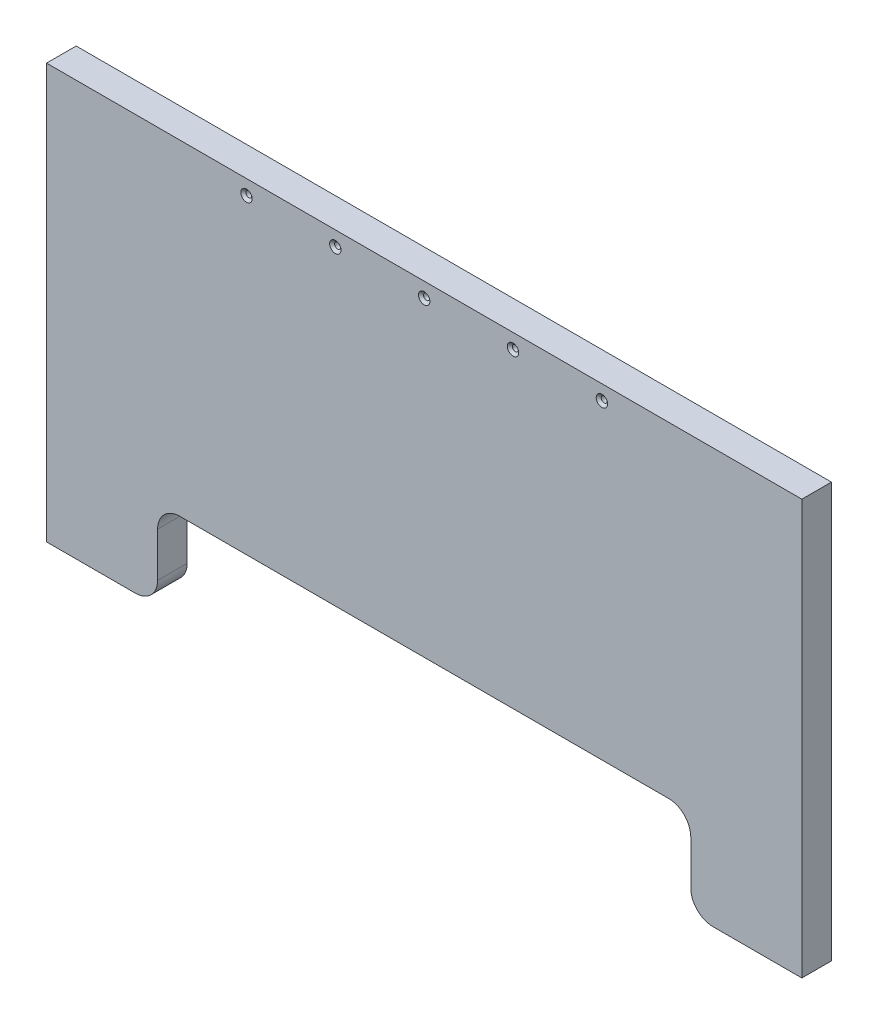
ISO-10303-21;
HEADER;
FILE_DESCRIPTION(('STEP AP214'),'2;1');
FILE_NAME('part.step','',(''),(''),'','','');
FILE_SCHEMA(('AUTOMOTIVE_DESIGN { 1 0 10303 214 1 1 1 1 }'));
ENDSEC;
DATA;
#1=APPLICATION_CONTEXT('core data for automotive mechanical design processes');
#2=APPLICATION_PROTOCOL_DEFINITION('international standard','automotive_design',2000,#1);
#3=PRODUCT_CONTEXT('',#1,'mechanical');
#4=PRODUCT('Part','Part','',(#3));
#5=PRODUCT_RELATED_PRODUCT_CATEGORY('part','',(#4));
#6=PRODUCT_DEFINITION_FORMATION('','',#4);
#7=PRODUCT_DEFINITION_CONTEXT('part definition',#1,'design');
#8=PRODUCT_DEFINITION('design','',#6,#7);
#9=PRODUCT_DEFINITION_SHAPE('','',#8);
#10=(LENGTH_UNIT() NAMED_UNIT(*) SI_UNIT(.MILLI.,.METRE.));
#11=(NAMED_UNIT(*) PLANE_ANGLE_UNIT() SI_UNIT($,.RADIAN.));
#12=(NAMED_UNIT(*) SI_UNIT($,.STERADIAN.) SOLID_ANGLE_UNIT());
#13=UNCERTAINTY_MEASURE_WITH_UNIT(LENGTH_MEASURE(1.E-05),#10,'distance_accuracy_value','');
#14=(GEOMETRIC_REPRESENTATION_CONTEXT(3) GLOBAL_UNCERTAINTY_ASSIGNED_CONTEXT((#13)) GLOBAL_UNIT_ASSIGNED_CONTEXT((#10,
#11,#12)) REPRESENTATION_CONTEXT('',''));
#15=CARTESIAN_POINT('',(0.,0.,0.));
#16=DIRECTION('',(0.,0.,1.));
#17=DIRECTION('',(1.,0.,0.));
#18=AXIS2_PLACEMENT_3D('',#15,#16,#17);
#19=CARTESIAN_POINT('',(323.85,279.4,25.4));
#20=DIRECTION('',(-1.,0.,0.));
#21=DIRECTION('',(0.,-1.,0.));
#22=AXIS2_PLACEMENT_3D('',#19,#20,#21);
#23=PLANE('',#22);
#24=DIRECTION('',(0.,1.,0.));
#25=VECTOR('',#24,1.);
#26=CARTESIAN_POINT('',(323.85,279.4,0.));
#27=LINE('',#26,#25);
#28=CARTESIAN_POINT('',(323.85,-76.2,0.));
#29=VERTEX_POINT('',#28);
#30=CARTESIAN_POINT('',(323.85,279.4,0.));
#31=VERTEX_POINT('',#30);
#32=EDGE_CURVE('E145',#29,#31,#27,.T.);
#33=ORIENTED_EDGE('',*,*,#32,.T.);
#34=DIRECTION('',(0.,0.,-1.));
#35=VECTOR('',#34,1.);
#36=CARTESIAN_POINT('',(323.85,279.4,25.4));
#37=LINE('',#36,#35);
#38=CARTESIAN_POINT('',(323.85,279.4,25.4));
#39=VERTEX_POINT('',#38);
#40=EDGE_CURVE('E126',#39,#31,#37,.T.);
#41=ORIENTED_EDGE('',*,*,#40,.F.);
#42=DIRECTION('',(0.,1.,0.));
#43=VECTOR('',#42,1.);
#44=CARTESIAN_POINT('',(323.85,279.4,25.4));
#45=LINE('',#44,#43);
#46=CARTESIAN_POINT('',(323.85,-76.2,25.4));
#47=VERTEX_POINT('',#46);
#48=EDGE_CURVE('E132',#47,#39,#45,.T.);
#49=ORIENTED_EDGE('',*,*,#48,.F.);
#50=DIRECTION('',(0.,0.,-1.));
#51=VECTOR('',#50,1.);
#52=CARTESIAN_POINT('',(323.85,-76.2,25.4));
#53=LINE('',#52,#51);
#54=EDGE_CURVE('E211',#47,#29,#53,.T.);
#55=ORIENTED_EDGE('',*,*,#54,.T.);
#56=EDGE_LOOP('',(#33,#41,#49,#55));
#57=FACE_BOUND('',#56,.T.);
#58=ADVANCED_FACE('F32',(#57),#23,.F.);
#59=CARTESIAN_POINT('',(-323.85,279.4,25.4));
#60=DIRECTION('',(0.,-1.,0.));
#61=DIRECTION('',(0.,0.,-1.));
#62=AXIS2_PLACEMENT_3D('',#59,#60,#61);
#63=PLANE('',#62);
#64=DIRECTION('',(-1.,0.,0.));
#65=VECTOR('',#64,1.);
#66=CARTESIAN_POINT('',(-323.85,279.4,0.));
#67=LINE('',#66,#65);
#68=CARTESIAN_POINT('',(-323.85,279.4,0.));
#69=VERTEX_POINT('',#68);
#70=EDGE_CURVE('E213',#31,#69,#67,.T.);
#71=ORIENTED_EDGE('',*,*,#70,.T.);
#72=DIRECTION('',(0.,0.,-1.));
#73=VECTOR('',#72,1.);
#74=CARTESIAN_POINT('',(-323.85,279.4,25.4));
#75=LINE('',#74,#73);
#76=CARTESIAN_POINT('',(-323.85,279.4,25.4));
#77=VERTEX_POINT('',#76);
#78=EDGE_CURVE('E129',#77,#69,#75,.T.);
#79=ORIENTED_EDGE('',*,*,#78,.F.);
#80=DIRECTION('',(-1.,0.,0.));
#81=VECTOR('',#80,1.);
#82=CARTESIAN_POINT('',(-323.85,279.4,25.4));
#83=LINE('',#82,#81);
#84=EDGE_CURVE('E122',#39,#77,#83,.T.);
#85=ORIENTED_EDGE('',*,*,#84,.F.);
#86=ORIENTED_EDGE('',*,*,#40,.T.);
#87=EDGE_LOOP('',(#71,#79,#85,#86));
#88=FACE_BOUND('',#87,.T.);
#89=ADVANCED_FACE('F124',(#88),#63,.F.);
#90=CARTESIAN_POINT('',(-323.85,279.4,25.4));
#91=DIRECTION('',(1.,0.,0.));
#92=DIRECTION('',(0.,1.,0.));
#93=AXIS2_PLACEMENT_3D('',#90,#91,#92);
#94=PLANE('',#93);
#95=DIRECTION('',(0.,-1.,0.));
#96=VECTOR('',#95,1.);
#97=CARTESIAN_POINT('',(-323.85,279.4,0.));
#98=LINE('',#97,#96);
#99=CARTESIAN_POINT('',(-323.85,-76.2,0.));
#100=VERTEX_POINT('',#99);
#101=EDGE_CURVE('E216',#69,#100,#98,.T.);
#102=ORIENTED_EDGE('',*,*,#101,.T.);
#103=DIRECTION('',(0.,0.,-1.));
#104=VECTOR('',#103,1.);
#105=CARTESIAN_POINT('',(-323.85,-76.2,25.4));
#106=LINE('',#105,#104);
#107=CARTESIAN_POINT('',(-323.85,-76.2,25.4));
#108=VERTEX_POINT('',#107);
#109=EDGE_CURVE('E150',#108,#100,#106,.T.);
#110=ORIENTED_EDGE('',*,*,#109,.F.);
#111=DIRECTION('',(0.,-1.,0.));
#112=VECTOR('',#111,1.);
#113=CARTESIAN_POINT('',(-323.85,279.4,25.4));
#114=LINE('',#113,#112);
#115=EDGE_CURVE('E131',#77,#108,#114,.T.);
#116=ORIENTED_EDGE('',*,*,#115,.F.);
#117=ORIENTED_EDGE('',*,*,#78,.T.);
#118=EDGE_LOOP('',(#102,#110,#116,#117));
#119=FACE_BOUND('',#118,.T.);
#120=ADVANCED_FACE('F318',(#119),#94,.F.);
#121=CARTESIAN_POINT('',(-323.85,-76.2,25.4));
#122=DIRECTION('',(0.,1.,0.));
#123=DIRECTION('',(-1.,0.,0.));
#124=AXIS2_PLACEMENT_3D('',#121,#122,#123);
#125=PLANE('',#124);
#126=DIRECTION('',(1.,0.,0.));
#127=VECTOR('',#126,1.);
#128=CARTESIAN_POINT('',(-323.85,-76.2,0.));
#129=LINE('',#128,#127);
#130=CARTESIAN_POINT('',(-247.65,-76.2,0.));
#131=VERTEX_POINT('',#130);
#132=EDGE_CURVE('E192',#100,#131,#129,.T.);
#133=ORIENTED_EDGE('',*,*,#132,.T.);
#134=DIRECTION('',(0.,0.,-1.));
#135=VECTOR('',#134,1.);
#136=CARTESIAN_POINT('',(-247.65,-76.2,25.4));
#137=LINE('',#136,#135);
#138=CARTESIAN_POINT('',(-247.65,-76.2,25.4));
#139=VERTEX_POINT('',#138);
#140=EDGE_CURVE('E175',#131,#139,#137,.F.);
#141=ORIENTED_EDGE('',*,*,#140,.T.);
#142=DIRECTION('',(1.,0.,0.));
#143=VECTOR('',#142,1.);
#144=CARTESIAN_POINT('',(-323.85,-76.2,25.4));
#145=LINE('',#144,#143);
#146=EDGE_CURVE('E206',#108,#139,#145,.T.);
#147=ORIENTED_EDGE('',*,*,#146,.F.);
#148=ORIENTED_EDGE('',*,*,#109,.T.);
#149=EDGE_LOOP('',(#133,#141,#147,#148));
#150=FACE_BOUND('',#149,.T.);
#151=ADVANCED_FACE('F230',(#150),#125,.F.);
#152=CARTESIAN_POINT('',(-228.6,-76.2,25.4));
#153=DIRECTION('',(-1.,0.,0.));
#154=DIRECTION('',(0.,0.,1.));
#155=AXIS2_PLACEMENT_3D('',#152,#153,#154);
#156=PLANE('',#155);
#157=DIRECTION('',(0.,1.,0.));
#158=VECTOR('',#157,1.);
#159=CARTESIAN_POINT('',(-228.6,-76.2,25.4));
#160=LINE('',#159,#158);
#161=CARTESIAN_POINT('',(-228.6,-57.15,25.4));
#162=VERTEX_POINT('',#161);
#163=CARTESIAN_POINT('',(-228.6,-19.05,25.4));
#164=VERTEX_POINT('',#163);
#165=EDGE_CURVE('E199',#162,#164,#160,.T.);
#166=ORIENTED_EDGE('',*,*,#165,.F.);
#167=DIRECTION('',(0.,0.,-1.));
#168=VECTOR('',#167,1.);
#169=CARTESIAN_POINT('',(-228.6,-57.15,25.4));
#170=LINE('',#169,#168);
#171=CARTESIAN_POINT('',(-228.6,-57.15,0.));
#172=VERTEX_POINT('',#171);
#173=EDGE_CURVE('E172',#162,#172,#170,.T.);
#174=ORIENTED_EDGE('',*,*,#173,.T.);
#175=DIRECTION('',(0.,1.,0.));
#176=VECTOR('',#175,1.);
#177=CARTESIAN_POINT('',(-228.6,-76.2,0.));
#178=LINE('',#177,#176);
#179=CARTESIAN_POINT('',(-228.6,-19.05,0.));
#180=VERTEX_POINT('',#179);
#181=EDGE_CURVE('E185',#172,#180,#178,.T.);
#182=ORIENTED_EDGE('',*,*,#181,.T.);
#183=DIRECTION('',(0.,0.,-1.));
#184=VECTOR('',#183,1.);
#185=CARTESIAN_POINT('',(-228.6,-19.05,25.4));
#186=LINE('',#185,#184);
#187=EDGE_CURVE('E47',#180,#164,#186,.F.);
#188=ORIENTED_EDGE('',*,*,#187,.T.);
#189=EDGE_LOOP('',(#166,#174,#182,#188));
#190=FACE_BOUND('',#189,.T.);
#191=ADVANCED_FACE('F190',(#190),#156,.F.);
#192=CARTESIAN_POINT('',(228.6,0.,25.4));
#193=DIRECTION('',(0.,1.,0.));
#194=DIRECTION('',(0.,0.,1.));
#195=AXIS2_PLACEMENT_3D('',#192,#193,#194);
#196=PLANE('',#195);
#197=DIRECTION('',(1.,0.,0.));
#198=VECTOR('',#197,1.);
#199=CARTESIAN_POINT('',(228.6,0.,0.));
#200=LINE('',#199,#198);
#201=CARTESIAN_POINT('',(-209.55,0.,0.));
#202=VERTEX_POINT('',#201);
#203=CARTESIAN_POINT('',(209.55,0.,0.));
#204=VERTEX_POINT('',#203);
#205=EDGE_CURVE('E187',#202,#204,#200,.T.);
#206=ORIENTED_EDGE('',*,*,#205,.T.);
#207=DIRECTION('',(0.,0.,-1.));
#208=VECTOR('',#207,1.);
#209=CARTESIAN_POINT('',(209.55,0.,25.4));
#210=LINE('',#209,#208);
#211=CARTESIAN_POINT('',(209.55,0.,25.4));
#212=VERTEX_POINT('',#211);
#213=EDGE_CURVE('E159',#204,#212,#210,.F.);
#214=ORIENTED_EDGE('',*,*,#213,.T.);
#215=DIRECTION('',(1.,0.,0.));
#216=VECTOR('',#215,1.);
#217=CARTESIAN_POINT('',(228.6,0.,25.4));
#218=LINE('',#217,#216);
#219=CARTESIAN_POINT('',(-209.55,0.,25.4));
#220=VERTEX_POINT('',#219);
#221=EDGE_CURVE('E197',#220,#212,#218,.T.);
#222=ORIENTED_EDGE('',*,*,#221,.F.);
#223=DIRECTION('',(0.,0.,-1.));
#224=VECTOR('',#223,1.);
#225=CARTESIAN_POINT('',(-209.55,0.,0.));
#226=LINE('',#225,#224);
#227=EDGE_CURVE('E156',#220,#202,#226,.T.);
#228=ORIENTED_EDGE('',*,*,#227,.T.);
#229=EDGE_LOOP('',(#206,#214,#222,#228));
#230=FACE_BOUND('',#229,.T.);
#231=ADVANCED_FACE('F201',(#230),#196,.F.);
#232=CARTESIAN_POINT('',(228.6,-76.2,25.4));
#233=DIRECTION('',(1.,0.,0.));
#234=DIRECTION('',(0.,0.,-1.));
#235=AXIS2_PLACEMENT_3D('',#232,#233,#234);
#236=PLANE('',#235);
#237=DIRECTION('',(0.,-1.,0.));
#238=VECTOR('',#237,1.);
#239=CARTESIAN_POINT('',(228.6,-76.2,25.4));
#240=LINE('',#239,#238);
#241=CARTESIAN_POINT('',(228.6,-19.05,25.4));
#242=VERTEX_POINT('',#241);
#243=CARTESIAN_POINT('',(228.6,-57.15,25.4));
#244=VERTEX_POINT('',#243);
#245=EDGE_CURVE('E203',#242,#244,#240,.T.);
#246=ORIENTED_EDGE('',*,*,#245,.F.);
#247=DIRECTION('',(0.,0.,-1.));
#248=VECTOR('',#247,1.);
#249=CARTESIAN_POINT('',(228.6,-19.05,0.));
#250=LINE('',#249,#248);
#251=CARTESIAN_POINT('',(228.6,-19.05,0.));
#252=VERTEX_POINT('',#251);
#253=EDGE_CURVE('E148',#242,#252,#250,.T.);
#254=ORIENTED_EDGE('',*,*,#253,.T.);
#255=DIRECTION('',(0.,-1.,0.));
#256=VECTOR('',#255,1.);
#257=CARTESIAN_POINT('',(228.6,-76.2,0.));
#258=LINE('',#257,#256);
#259=CARTESIAN_POINT('',(228.6,-57.15,0.));
#260=VERTEX_POINT('',#259);
#261=EDGE_CURVE('E221',#252,#260,#258,.T.);
#262=ORIENTED_EDGE('',*,*,#261,.T.);
#263=DIRECTION('',(0.,0.,-1.));
#264=VECTOR('',#263,1.);
#265=CARTESIAN_POINT('',(228.6,-57.15,25.4));
#266=LINE('',#265,#264);
#267=EDGE_CURVE('E146',#260,#244,#266,.F.);
#268=ORIENTED_EDGE('',*,*,#267,.T.);
#269=EDGE_LOOP('',(#246,#254,#262,#268));
#270=FACE_BOUND('',#269,.T.);
#271=ADVANCED_FACE('F453',(#270),#236,.F.);
#272=CARTESIAN_POINT('',(323.85,-76.2,25.4));
#273=DIRECTION('',(0.,1.,0.));
#274=DIRECTION('',(-1.,0.,0.));
#275=AXIS2_PLACEMENT_3D('',#272,#273,#274);
#276=PLANE('',#275);
#277=DIRECTION('',(1.,0.,0.));
#278=VECTOR('',#277,1.);
#279=CARTESIAN_POINT('',(323.85,-76.2,25.4));
#280=LINE('',#279,#278);
#281=CARTESIAN_POINT('',(247.65,-76.2,25.4));
#282=VERTEX_POINT('',#281);
#283=EDGE_CURVE('E138',#282,#47,#280,.T.);
#284=ORIENTED_EDGE('',*,*,#283,.F.);
#285=DIRECTION('',(0.,0.,-1.));
#286=VECTOR('',#285,1.);
#287=CARTESIAN_POINT('',(247.65,-76.2,25.4));
#288=LINE('',#287,#286);
#289=CARTESIAN_POINT('',(247.65,-76.2,0.));
#290=VERTEX_POINT('',#289);
#291=EDGE_CURVE('E161',#282,#290,#288,.T.);
#292=ORIENTED_EDGE('',*,*,#291,.T.);
#293=DIRECTION('',(1.,0.,0.));
#294=VECTOR('',#293,1.);
#295=CARTESIAN_POINT('',(323.85,-76.2,0.));
#296=LINE('',#295,#294);
#297=EDGE_CURVE('E142',#290,#29,#296,.T.);
#298=ORIENTED_EDGE('',*,*,#297,.T.);
#299=ORIENTED_EDGE('',*,*,#54,.F.);
#300=EDGE_LOOP('',(#284,#292,#298,#299));
#301=FACE_BOUND('',#300,.T.);
#302=ADVANCED_FACE('F287',(#301),#276,.F.);
#303=CARTESIAN_POINT('',(0.,0.,25.4));
#304=DIRECTION('',(0.,0.,-1.));
#305=DIRECTION('',(-1.,0.,0.));
#306=AXIS2_PLACEMENT_3D('',#303,#304,#305);
#307=PLANE('',#306);
#308=CARTESIAN_POINT('',(0.,266.7,25.4));
#309=DIRECTION('',(0.,0.,1.));
#310=DIRECTION('',(1.,0.,0.));
#311=AXIS2_PLACEMENT_3D('',#308,#309,#310);
#312=CIRCLE('',#311,4.8895);
#313=CARTESIAN_POINT('',(4.8895,266.7,25.4));
#314=VERTEX_POINT('',#313);
#315=EDGE_CURVE('E279',#314,#314,#312,.T.);
#316=ORIENTED_EDGE('',*,*,#315,.F.);
#317=EDGE_LOOP('',(#316));
#318=FACE_BOUND('',#317,.T.);
#319=CARTESIAN_POINT('',(76.2,266.7,25.4));
#320=DIRECTION('',(0.,0.,1.));
#321=DIRECTION('',(1.,0.,0.));
#322=AXIS2_PLACEMENT_3D('',#319,#320,#321);
#323=CIRCLE('',#322,4.88950000000001);
#324=CARTESIAN_POINT('',(81.0895,266.7,25.4));
#325=VERTEX_POINT('',#324);
#326=EDGE_CURVE('E270',#325,#325,#323,.T.);
#327=ORIENTED_EDGE('',*,*,#326,.F.);
#328=EDGE_LOOP('',(#327));
#329=FACE_BOUND('',#328,.T.);
#330=CARTESIAN_POINT('',(152.4,266.7,25.4));
#331=DIRECTION('',(0.,0.,1.));
#332=DIRECTION('',(1.,0.,0.));
#333=AXIS2_PLACEMENT_3D('',#330,#331,#332);
#334=CIRCLE('',#333,4.88949999999999);
#335=CARTESIAN_POINT('',(157.2895,266.7,25.4));
#336=VERTEX_POINT('',#335);
#337=EDGE_CURVE('E261',#336,#336,#334,.T.);
#338=ORIENTED_EDGE('',*,*,#337,.F.);
#339=EDGE_LOOP('',(#338));
#340=FACE_BOUND('',#339,.T.);
#341=CARTESIAN_POINT('',(-76.2,266.699999999999,25.4));
#342=DIRECTION('',(0.,0.,1.));
#343=DIRECTION('',(1.,0.,0.));
#344=AXIS2_PLACEMENT_3D('',#341,#342,#343);
#345=CIRCLE('',#344,4.88950000000001);
#346=CARTESIAN_POINT('',(-71.3105,266.699999999999,25.4));
#347=VERTEX_POINT('',#346);
#348=EDGE_CURVE('E252',#347,#347,#345,.T.);
#349=ORIENTED_EDGE('',*,*,#348,.F.);
#350=EDGE_LOOP('',(#349));
#351=FACE_BOUND('',#350,.T.);
#352=CARTESIAN_POINT('',(-152.4,266.699999999999,25.4));
#353=DIRECTION('',(0.,0.,1.));
#354=DIRECTION('',(1.,0.,0.));
#355=AXIS2_PLACEMENT_3D('',#352,#353,#354);
#356=CIRCLE('',#355,4.88949999999999);
#357=CARTESIAN_POINT('',(-147.5105,266.699999999999,25.4));
#358=VERTEX_POINT('',#357);
#359=EDGE_CURVE('E243',#358,#358,#356,.T.);
#360=ORIENTED_EDGE('',*,*,#359,.F.);
#361=EDGE_LOOP('',(#360));
#362=FACE_BOUND('',#361,.T.);
#363=ORIENTED_EDGE('',*,*,#245,.T.);
#364=CARTESIAN_POINT('',(247.65,-57.15,25.4));
#365=DIRECTION('',(0.,0.,-1.));
#366=DIRECTION('',(-1.,0.,0.));
#367=AXIS2_PLACEMENT_3D('',#364,#365,#366);
#368=CIRCLE('',#367,19.05);
#369=EDGE_CURVE('E169',#244,#282,#368,.F.);
#370=ORIENTED_EDGE('',*,*,#369,.T.);
#371=ORIENTED_EDGE('',*,*,#283,.T.);
#372=ORIENTED_EDGE('',*,*,#48,.T.);
#373=ORIENTED_EDGE('',*,*,#84,.T.);
#374=ORIENTED_EDGE('',*,*,#115,.T.);
#375=ORIENTED_EDGE('',*,*,#146,.T.);
#376=CARTESIAN_POINT('',(-247.65,-57.15,25.4));
#377=DIRECTION('',(0.,0.,-1.));
#378=DIRECTION('',(-1.,0.,0.));
#379=AXIS2_PLACEMENT_3D('',#376,#377,#378);
#380=CIRCLE('',#379,19.05);
#381=EDGE_CURVE('E54',#139,#162,#380,.F.);
#382=ORIENTED_EDGE('',*,*,#381,.T.);
#383=ORIENTED_EDGE('',*,*,#165,.T.);
#384=CARTESIAN_POINT('',(-209.55,-19.05,25.4));
#385=DIRECTION('',(0.,0.,-1.));
#386=DIRECTION('',(-1.,0.,0.));
#387=AXIS2_PLACEMENT_3D('',#384,#385,#386);
#388=CIRCLE('',#387,19.05);
#389=EDGE_CURVE('E11',#164,#220,#388,.T.);
#390=ORIENTED_EDGE('',*,*,#389,.T.);
#391=ORIENTED_EDGE('',*,*,#221,.T.);
#392=CARTESIAN_POINT('',(209.55,-19.05,25.4));
#393=DIRECTION('',(0.,0.,-1.));
#394=DIRECTION('',(-1.,0.,0.));
#395=AXIS2_PLACEMENT_3D('',#392,#393,#394);
#396=CIRCLE('',#395,19.05);
#397=EDGE_CURVE('E179',#212,#242,#396,.T.);
#398=ORIENTED_EDGE('',*,*,#397,.T.);
#399=EDGE_LOOP('',(#363,#370,#371,#372,#373,#374,#375,#382,#383,#390,#391,#398));
#400=FACE_BOUND('',#399,.T.);
#401=ADVANCED_FACE('F136',(#318,#329,#340,#351,#362,#400),#307,.F.);
#402=CARTESIAN_POINT('',(0.,0.,0.));
#403=DIRECTION('',(0.,0.,-1.));
#404=DIRECTION('',(-1.,0.,0.));
#405=AXIS2_PLACEMENT_3D('',#402,#403,#404);
#406=PLANE('',#405);
#407=CARTESIAN_POINT('',(0.,266.7,0.));
#408=DIRECTION('',(0.,0.,1.));
#409=DIRECTION('',(1.,0.,0.));
#410=AXIS2_PLACEMENT_3D('',#407,#408,#409);
#411=CIRCLE('',#410,2.5527);
#412=CARTESIAN_POINT('',(2.5527,266.7,0.));
#413=VERTEX_POINT('',#412);
#414=EDGE_CURVE('E273',#413,#413,#411,.T.);
#415=ORIENTED_EDGE('',*,*,#414,.T.);
#416=EDGE_LOOP('',(#415));
#417=FACE_BOUND('',#416,.T.);
#418=CARTESIAN_POINT('',(76.2,266.7,0.));
#419=DIRECTION('',(0.,0.,1.));
#420=DIRECTION('',(1.,0.,0.));
#421=AXIS2_PLACEMENT_3D('',#418,#419,#420);
#422=CIRCLE('',#421,2.55270000000001);
#423=CARTESIAN_POINT('',(78.7527,266.7,0.));
#424=VERTEX_POINT('',#423);
#425=EDGE_CURVE('E264',#424,#424,#422,.T.);
#426=ORIENTED_EDGE('',*,*,#425,.T.);
#427=EDGE_LOOP('',(#426));
#428=FACE_BOUND('',#427,.T.);
#429=CARTESIAN_POINT('',(152.4,266.7,0.));
#430=DIRECTION('',(0.,0.,1.));
#431=DIRECTION('',(1.,0.,0.));
#432=AXIS2_PLACEMENT_3D('',#429,#430,#431);
#433=CIRCLE('',#432,2.55269999999999);
#434=CARTESIAN_POINT('',(154.9527,266.7,0.));
#435=VERTEX_POINT('',#434);
#436=EDGE_CURVE('E255',#435,#435,#433,.T.);
#437=ORIENTED_EDGE('',*,*,#436,.T.);
#438=EDGE_LOOP('',(#437));
#439=FACE_BOUND('',#438,.T.);
#440=CARTESIAN_POINT('',(-76.2,266.699999999999,0.));
#441=DIRECTION('',(0.,0.,1.));
#442=DIRECTION('',(1.,0.,0.));
#443=AXIS2_PLACEMENT_3D('',#440,#441,#442);
#444=CIRCLE('',#443,2.55270000000001);
#445=CARTESIAN_POINT('',(-73.6473,266.699999999999,0.));
#446=VERTEX_POINT('',#445);
#447=EDGE_CURVE('E246',#446,#446,#444,.T.);
#448=ORIENTED_EDGE('',*,*,#447,.T.);
#449=EDGE_LOOP('',(#448));
#450=FACE_BOUND('',#449,.T.);
#451=CARTESIAN_POINT('',(-152.4,266.699999999999,0.));
#452=DIRECTION('',(0.,0.,1.));
#453=DIRECTION('',(1.,0.,0.));
#454=AXIS2_PLACEMENT_3D('',#451,#452,#453);
#455=CIRCLE('',#454,2.55269999999999);
#456=CARTESIAN_POINT('',(-149.8473,266.699999999999,0.));
#457=VERTEX_POINT('',#456);
#458=EDGE_CURVE('E214',#457,#457,#455,.T.);
#459=ORIENTED_EDGE('',*,*,#458,.T.);
#460=EDGE_LOOP('',(#459));
#461=FACE_BOUND('',#460,.T.);
#462=ORIENTED_EDGE('',*,*,#297,.F.);
#463=CARTESIAN_POINT('',(247.65,-57.15,0.));
#464=DIRECTION('',(0.,0.,-1.));
#465=DIRECTION('',(-1.,0.,0.));
#466=AXIS2_PLACEMENT_3D('',#463,#464,#465);
#467=CIRCLE('',#466,19.05);
#468=EDGE_CURVE('E166',#290,#260,#467,.T.);
#469=ORIENTED_EDGE('',*,*,#468,.T.);
#470=ORIENTED_EDGE('',*,*,#261,.F.);
#471=CARTESIAN_POINT('',(209.55,-19.05,0.));
#472=DIRECTION('',(0.,0.,-1.));
#473=DIRECTION('',(-1.,0.,0.));
#474=AXIS2_PLACEMENT_3D('',#471,#472,#473);
#475=CIRCLE('',#474,19.05);
#476=EDGE_CURVE('E177',#252,#204,#475,.F.);
#477=ORIENTED_EDGE('',*,*,#476,.T.);
#478=ORIENTED_EDGE('',*,*,#205,.F.);
#479=CARTESIAN_POINT('',(-209.55,-19.05,0.));
#480=DIRECTION('',(0.,0.,-1.));
#481=DIRECTION('',(-1.,0.,0.));
#482=AXIS2_PLACEMENT_3D('',#479,#480,#481);
#483=CIRCLE('',#482,19.05);
#484=EDGE_CURVE('E40',#202,#180,#483,.F.);
#485=ORIENTED_EDGE('',*,*,#484,.T.);
#486=ORIENTED_EDGE('',*,*,#181,.F.);
#487=CARTESIAN_POINT('',(-247.65,-57.15,0.));
#488=DIRECTION('',(0.,0.,-1.));
#489=DIRECTION('',(-1.,0.,0.));
#490=AXIS2_PLACEMENT_3D('',#487,#488,#489);
#491=CIRCLE('',#490,19.05);
#492=EDGE_CURVE('E164',#172,#131,#491,.T.);
#493=ORIENTED_EDGE('',*,*,#492,.T.);
#494=ORIENTED_EDGE('',*,*,#132,.F.);
#495=ORIENTED_EDGE('',*,*,#101,.F.);
#496=ORIENTED_EDGE('',*,*,#70,.F.);
#497=ORIENTED_EDGE('',*,*,#32,.F.);
#498=EDGE_LOOP('',(#462,#469,#470,#477,#478,#485,#486,#493,#494,#495,#496,#497));
#499=FACE_BOUND('',#498,.T.);
#500=ADVANCED_FACE('F184',(#417,#428,#439,#450,#461,#499),#406,.T.);
#501=CARTESIAN_POINT('',(209.55,-19.05,25.4));
#502=DIRECTION('',(0.,0.,1.));
#503=DIRECTION('',(1.,0.,0.));
#504=AXIS2_PLACEMENT_3D('',#501,#502,#503);
#505=CYLINDRICAL_SURFACE('',#504,19.05);
#506=ORIENTED_EDGE('',*,*,#397,.F.);
#507=ORIENTED_EDGE('',*,*,#213,.F.);
#508=ORIENTED_EDGE('',*,*,#476,.F.);
#509=ORIENTED_EDGE('',*,*,#253,.F.);
#510=EDGE_LOOP('',(#506,#507,#508,#509));
#511=FACE_BOUND('',#510,.T.);
#512=ADVANCED_FACE('F322',(#511),#505,.F.);
#513=CARTESIAN_POINT('',(247.65,-57.15,25.4));
#514=DIRECTION('',(0.,0.,-1.));
#515=DIRECTION('',(-1.,0.,0.));
#516=AXIS2_PLACEMENT_3D('',#513,#514,#515);
#517=CYLINDRICAL_SURFACE('',#516,19.05);
#518=ORIENTED_EDGE('',*,*,#369,.F.);
#519=ORIENTED_EDGE('',*,*,#267,.F.);
#520=ORIENTED_EDGE('',*,*,#468,.F.);
#521=ORIENTED_EDGE('',*,*,#291,.F.);
#522=EDGE_LOOP('',(#518,#519,#520,#521));
#523=FACE_BOUND('',#522,.T.);
#524=ADVANCED_FACE('F325',(#523),#517,.T.);
#525=CARTESIAN_POINT('',(-247.65,-57.15,25.4));
#526=DIRECTION('',(0.,0.,-1.));
#527=DIRECTION('',(-1.,0.,0.));
#528=AXIS2_PLACEMENT_3D('',#525,#526,#527);
#529=CYLINDRICAL_SURFACE('',#528,19.05);
#530=ORIENTED_EDGE('',*,*,#381,.F.);
#531=ORIENTED_EDGE('',*,*,#140,.F.);
#532=ORIENTED_EDGE('',*,*,#492,.F.);
#533=ORIENTED_EDGE('',*,*,#173,.F.);
#534=EDGE_LOOP('',(#530,#531,#532,#533));
#535=FACE_BOUND('',#534,.T.);
#536=ADVANCED_FACE('F235',(#535),#529,.T.);
#537=CARTESIAN_POINT('',(-209.55,-19.05,25.4));
#538=DIRECTION('',(0.,0.,1.));
#539=DIRECTION('',(1.,0.,0.));
#540=AXIS2_PLACEMENT_3D('',#537,#538,#539);
#541=CYLINDRICAL_SURFACE('',#540,19.05);
#542=ORIENTED_EDGE('',*,*,#389,.F.);
#543=ORIENTED_EDGE('',*,*,#187,.F.);
#544=ORIENTED_EDGE('',*,*,#484,.F.);
#545=ORIENTED_EDGE('',*,*,#227,.F.);
#546=EDGE_LOOP('',(#542,#543,#544,#545));
#547=FACE_BOUND('',#546,.T.);
#548=ADVANCED_FACE('F34',(#547),#541,.F.);
#549=CARTESIAN_POINT('',(-152.4,266.699999999999,25.4));
#550=DIRECTION('',(0.,0.,1.));
#551=DIRECTION('',(1.,0.,0.));
#552=AXIS2_PLACEMENT_3D('',#549,#550,#551);
#553=CYLINDRICAL_SURFACE('',#552,2.55269999999999);
#554=ORIENTED_EDGE('',*,*,#458,.F.);
#555=EDGE_LOOP('',(#554));
#556=FACE_BOUND('',#555,.T.);
#557=CARTESIAN_POINT('',(-152.4,266.699999999999,23.4391919818649));
#558=DIRECTION('',(0.,0.,1.));
#559=DIRECTION('',(1.,0.,0.));
#560=AXIS2_PLACEMENT_3D('',#557,#558,#559);
#561=CIRCLE('',#560,2.55269999999999);
#562=CARTESIAN_POINT('',(-149.8473,266.699999999999,23.4391919818649));
#563=VERTEX_POINT('',#562);
#564=EDGE_CURVE('E240',#563,#563,#561,.T.);
#565=ORIENTED_EDGE('',*,*,#564,.T.);
#566=EDGE_LOOP('',(#565));
#567=FACE_BOUND('',#566,.T.);
#568=ADVANCED_FACE('F300',(#556,#567),#553,.F.);
#569=CARTESIAN_POINT('',(-152.4,266.699999999999,25.4));
#570=DIRECTION('',(0.,0.,1.));
#571=DIRECTION('',(1.,0.,0.));
#572=AXIS2_PLACEMENT_3D('',#569,#570,#571);
#573=CONICAL_SURFACE('',#572,4.88949999999999,0.872664625997164);
#574=ORIENTED_EDGE('',*,*,#564,.F.);
#575=EDGE_LOOP('',(#574));
#576=FACE_BOUND('',#575,.T.);
#577=ORIENTED_EDGE('',*,*,#359,.T.);
#578=EDGE_LOOP('',(#577));
#579=FACE_BOUND('',#578,.T.);
#580=ADVANCED_FACE('F297',(#576,#579),#573,.F.);
#581=CARTESIAN_POINT('',(-76.2,266.699999999999,25.4));
#582=DIRECTION('',(0.,0.,1.));
#583=DIRECTION('',(1.,0.,0.));
#584=AXIS2_PLACEMENT_3D('',#581,#582,#583);
#585=CYLINDRICAL_SURFACE('',#584,2.55270000000001);
#586=ORIENTED_EDGE('',*,*,#447,.F.);
#587=EDGE_LOOP('',(#586));
#588=FACE_BOUND('',#587,.T.);
#589=CARTESIAN_POINT('',(-76.2,266.699999999999,23.4391919818649));
#590=DIRECTION('',(0.,0.,1.));
#591=DIRECTION('',(1.,0.,0.));
#592=AXIS2_PLACEMENT_3D('',#589,#590,#591);
#593=CIRCLE('',#592,2.55270000000001);
#594=CARTESIAN_POINT('',(-73.6473,266.699999999999,23.4391919818649));
#595=VERTEX_POINT('',#594);
#596=EDGE_CURVE('E249',#595,#595,#593,.T.);
#597=ORIENTED_EDGE('',*,*,#596,.T.);
#598=EDGE_LOOP('',(#597));
#599=FACE_BOUND('',#598,.T.);
#600=ADVANCED_FACE('F299',(#588,#599),#585,.F.);
#601=CARTESIAN_POINT('',(-76.2,266.699999999999,25.4));
#602=DIRECTION('',(0.,0.,1.));
#603=DIRECTION('',(1.,0.,0.));
#604=AXIS2_PLACEMENT_3D('',#601,#602,#603);
#605=CONICAL_SURFACE('',#604,4.88950000000001,0.872664625997164);
#606=ORIENTED_EDGE('',*,*,#596,.F.);
#607=EDGE_LOOP('',(#606));
#608=FACE_BOUND('',#607,.T.);
#609=ORIENTED_EDGE('',*,*,#348,.T.);
#610=EDGE_LOOP('',(#609));
#611=FACE_BOUND('',#610,.T.);
#612=ADVANCED_FACE('F307',(#608,#611),#605,.F.);
#613=CARTESIAN_POINT('',(152.4,266.7,25.4));
#614=DIRECTION('',(0.,0.,1.));
#615=DIRECTION('',(1.,0.,0.));
#616=AXIS2_PLACEMENT_3D('',#613,#614,#615);
#617=CYLINDRICAL_SURFACE('',#616,2.55269999999999);
#618=ORIENTED_EDGE('',*,*,#436,.F.);
#619=EDGE_LOOP('',(#618));
#620=FACE_BOUND('',#619,.T.);
#621=CARTESIAN_POINT('',(152.4,266.7,23.4391919818649));
#622=DIRECTION('',(0.,0.,1.));
#623=DIRECTION('',(1.,0.,0.));
#624=AXIS2_PLACEMENT_3D('',#621,#622,#623);
#625=CIRCLE('',#624,2.55269999999999);
#626=CARTESIAN_POINT('',(154.9527,266.7,23.4391919818649));
#627=VERTEX_POINT('',#626);
#628=EDGE_CURVE('E258',#627,#627,#625,.T.);
#629=ORIENTED_EDGE('',*,*,#628,.T.);
#630=EDGE_LOOP('',(#629));
#631=FACE_BOUND('',#630,.T.);
#632=ADVANCED_FACE('F363',(#620,#631),#617,.F.);
#633=CARTESIAN_POINT('',(152.4,266.7,25.4));
#634=DIRECTION('',(0.,0.,1.));
#635=DIRECTION('',(1.,0.,0.));
#636=AXIS2_PLACEMENT_3D('',#633,#634,#635);
#637=CONICAL_SURFACE('',#636,4.88949999999999,0.872664625997164);
#638=ORIENTED_EDGE('',*,*,#628,.F.);
#639=EDGE_LOOP('',(#638));
#640=FACE_BOUND('',#639,.T.);
#641=ORIENTED_EDGE('',*,*,#337,.T.);
#642=EDGE_LOOP('',(#641));
#643=FACE_BOUND('',#642,.T.);
#644=ADVANCED_FACE('F373',(#640,#643),#637,.F.);
#645=CARTESIAN_POINT('',(76.2,266.7,25.4));
#646=DIRECTION('',(0.,0.,1.));
#647=DIRECTION('',(1.,0.,0.));
#648=AXIS2_PLACEMENT_3D('',#645,#646,#647);
#649=CYLINDRICAL_SURFACE('',#648,2.55270000000001);
#650=ORIENTED_EDGE('',*,*,#425,.F.);
#651=EDGE_LOOP('',(#650));
#652=FACE_BOUND('',#651,.T.);
#653=CARTESIAN_POINT('',(76.2,266.7,23.4391919818649));
#654=DIRECTION('',(0.,0.,1.));
#655=DIRECTION('',(1.,0.,0.));
#656=AXIS2_PLACEMENT_3D('',#653,#654,#655);
#657=CIRCLE('',#656,2.55270000000001);
#658=CARTESIAN_POINT('',(78.7527,266.7,23.4391919818649));
#659=VERTEX_POINT('',#658);
#660=EDGE_CURVE('E267',#659,#659,#657,.T.);
#661=ORIENTED_EDGE('',*,*,#660,.T.);
#662=EDGE_LOOP('',(#661));
#663=FACE_BOUND('',#662,.T.);
#664=ADVANCED_FACE('F383',(#652,#663),#649,.F.);
#665=CARTESIAN_POINT('',(76.2,266.7,25.4));
#666=DIRECTION('',(0.,0.,1.));
#667=DIRECTION('',(1.,0.,0.));
#668=AXIS2_PLACEMENT_3D('',#665,#666,#667);
#669=CONICAL_SURFACE('',#668,4.88950000000001,0.872664625997164);
#670=ORIENTED_EDGE('',*,*,#660,.F.);
#671=EDGE_LOOP('',(#670));
#672=FACE_BOUND('',#671,.T.);
#673=ORIENTED_EDGE('',*,*,#326,.T.);
#674=EDGE_LOOP('',(#673));
#675=FACE_BOUND('',#674,.T.);
#676=ADVANCED_FACE('F393',(#672,#675),#669,.F.);
#677=CARTESIAN_POINT('',(0.,266.7,25.4));
#678=DIRECTION('',(0.,0.,1.));
#679=DIRECTION('',(1.,0.,0.));
#680=AXIS2_PLACEMENT_3D('',#677,#678,#679);
#681=CYLINDRICAL_SURFACE('',#680,2.5527);
#682=ORIENTED_EDGE('',*,*,#414,.F.);
#683=EDGE_LOOP('',(#682));
#684=FACE_BOUND('',#683,.T.);
#685=CARTESIAN_POINT('',(0.,266.7,23.4391919818649));
#686=DIRECTION('',(0.,0.,1.));
#687=DIRECTION('',(1.,0.,0.));
#688=AXIS2_PLACEMENT_3D('',#685,#686,#687);
#689=CIRCLE('',#688,2.5527);
#690=CARTESIAN_POINT('',(2.5527,266.7,23.4391919818649));
#691=VERTEX_POINT('',#690);
#692=EDGE_CURVE('E276',#691,#691,#689,.T.);
#693=ORIENTED_EDGE('',*,*,#692,.T.);
#694=EDGE_LOOP('',(#693));
#695=FACE_BOUND('',#694,.T.);
#696=ADVANCED_FACE('F403',(#684,#695),#681,.F.);
#697=CARTESIAN_POINT('',(0.,266.7,25.4));
#698=DIRECTION('',(0.,0.,1.));
#699=DIRECTION('',(1.,0.,0.));
#700=AXIS2_PLACEMENT_3D('',#697,#698,#699);
#701=CONICAL_SURFACE('',#700,4.8895,0.872664625997164);
#702=ORIENTED_EDGE('',*,*,#692,.F.);
#703=EDGE_LOOP('',(#702));
#704=FACE_BOUND('',#703,.T.);
#705=ORIENTED_EDGE('',*,*,#315,.T.);
#706=EDGE_LOOP('',(#705));
#707=FACE_BOUND('',#706,.T.);
#708=ADVANCED_FACE('F283',(#704,#707),#701,.F.);
#709=CLOSED_SHELL('',(#58,#89,#120,#151,#191,#231,#271,#302,#401,#500,#512,#524,#536,#548,#568,
#580,#600,#612,#632,#644,#664,#676,#696,#708));
#710=MANIFOLD_SOLID_BREP('B2',#709);
#711=ADVANCED_BREP_SHAPE_REPRESENTATION('',(#18,#710),#14);
#712=SHAPE_DEFINITION_REPRESENTATION(#9,#711);
ENDSEC;
END-ISO-10303-21;
